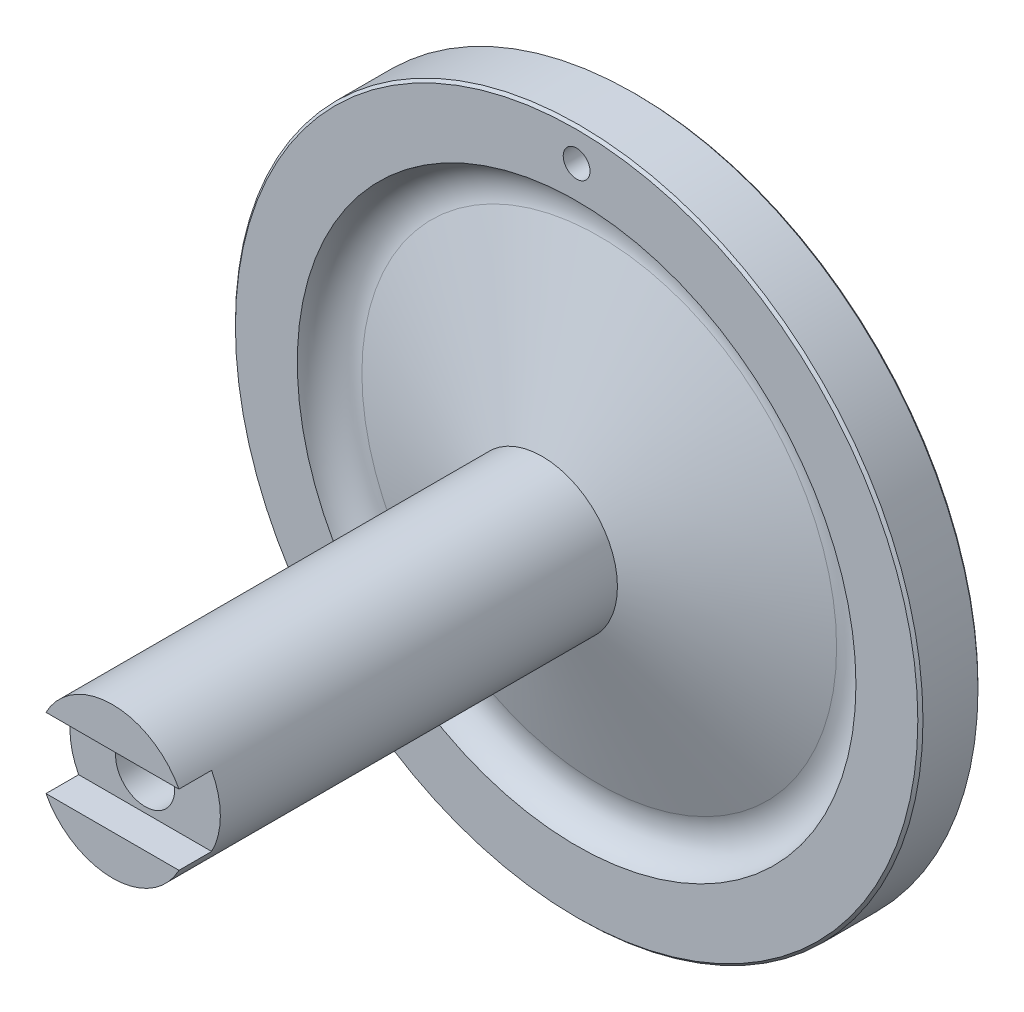
ISO-10303-21;
HEADER;
FILE_DESCRIPTION(('STEP AP214'),'2;1');
FILE_NAME('part.step','',(''),(''),'','','');
FILE_SCHEMA(('AUTOMOTIVE_DESIGN { 1 0 10303 214 1 1 1 1 }'));
ENDSEC;
DATA;
#1=APPLICATION_CONTEXT('core data for automotive mechanical design processes');
#2=APPLICATION_PROTOCOL_DEFINITION('international standard','automotive_design',2000,#1);
#3=PRODUCT_CONTEXT('',#1,'mechanical');
#4=PRODUCT('Part','Part','',(#3));
#5=PRODUCT_RELATED_PRODUCT_CATEGORY('part','',(#4));
#6=PRODUCT_DEFINITION_FORMATION('','',#4);
#7=PRODUCT_DEFINITION_CONTEXT('part definition',#1,'design');
#8=PRODUCT_DEFINITION('design','',#6,#7);
#9=PRODUCT_DEFINITION_SHAPE('','',#8);
#10=(LENGTH_UNIT() NAMED_UNIT(*) SI_UNIT(.MILLI.,.METRE.));
#11=(NAMED_UNIT(*) PLANE_ANGLE_UNIT() SI_UNIT($,.RADIAN.));
#12=(NAMED_UNIT(*) SI_UNIT($,.STERADIAN.) SOLID_ANGLE_UNIT());
#13=UNCERTAINTY_MEASURE_WITH_UNIT(LENGTH_MEASURE(1.E-05),#10,'distance_accuracy_value','');
#14=(GEOMETRIC_REPRESENTATION_CONTEXT(3) GLOBAL_UNCERTAINTY_ASSIGNED_CONTEXT((#13)) GLOBAL_UNIT_ASSIGNED_CONTEXT((#10,
#11,#12)) REPRESENTATION_CONTEXT('',''));
#15=CARTESIAN_POINT('',(0.,0.,0.));
#16=DIRECTION('',(0.,0.,1.));
#17=DIRECTION('',(1.,0.,0.));
#18=AXIS2_PLACEMENT_3D('',#15,#16,#17);
#19=CARTESIAN_POINT('',(0.,8.7376,0.));
#20=DIRECTION('',(0.,0.,-1.));
#21=DIRECTION('',(-1.,0.,0.));
#22=AXIS2_PLACEMENT_3D('',#19,#20,#21);
#23=PLANE('',#22);
#24=CARTESIAN_POINT('',(0.,0.,0.));
#25=DIRECTION('',(0.,0.,1.));
#26=DIRECTION('',(1.,0.,0.));
#27=AXIS2_PLACEMENT_3D('',#24,#25,#26);
#28=CIRCLE('',#27,22.225);
#29=CARTESIAN_POINT('',(19.6475854760833,10.3886,0.));
#30=VERTEX_POINT('',#29);
#31=CARTESIAN_POINT('',(-19.6475854760833,10.3886,0.));
#32=VERTEX_POINT('',#31);
#33=EDGE_CURVE('E146',#30,#32,#28,.T.);
#34=ORIENTED_EDGE('',*,*,#33,.T.);
#35=DIRECTION('',(1.,0.,0.));
#36=VECTOR('',#35,1.);
#37=CARTESIAN_POINT('',(-101.6,10.3886,0.));
#38=LINE('',#37,#36);
#39=EDGE_CURVE('E92',#32,#30,#38,.T.);
#40=ORIENTED_EDGE('',*,*,#39,.T.);
#41=EDGE_LOOP('',(#34,#40));
#42=FACE_BOUND('',#41,.T.);
#43=ADVANCED_FACE('F44',(#42),#23,.F.);
#44=CARTESIAN_POINT('',(0.,0.,0.));
#45=DIRECTION('',(0.,0.,1.));
#46=DIRECTION('',(1.,0.,0.));
#47=AXIS2_PLACEMENT_3D('',#44,#45,#46);
#48=CYLINDRICAL_SURFACE('',#47,22.225);
#49=ORIENTED_EDGE('',*,*,#33,.F.);
#50=DIRECTION('',(0.,0.,1.));
#51=VECTOR('',#50,1.);
#52=CARTESIAN_POINT('',(19.6475854760833,10.3886,0.));
#53=LINE('',#52,#51);
#54=CARTESIAN_POINT('',(19.6475854760833,10.3886,-9.652));
#55=VERTEX_POINT('',#54);
#56=EDGE_CURVE('E70',#30,#55,#53,.F.);
#57=ORIENTED_EDGE('',*,*,#56,.T.);
#58=CARTESIAN_POINT('',(0.,0.,-9.652));
#59=DIRECTION('',(0.,0.,-1.));
#60=DIRECTION('',(0.,1.,0.));
#61=AXIS2_PLACEMENT_3D('',#58,#59,#60);
#62=CIRCLE('',#61,22.225);
#63=CARTESIAN_POINT('',(19.6475854760833,-10.3886,-9.652));
#64=VERTEX_POINT('',#63);
#65=EDGE_CURVE('E104',#55,#64,#62,.T.);
#66=ORIENTED_EDGE('',*,*,#65,.T.);
#67=DIRECTION('',(0.,0.,1.));
#68=VECTOR('',#67,1.);
#69=CARTESIAN_POINT('',(19.6475854760833,-10.3886,0.));
#70=LINE('',#69,#68);
#71=CARTESIAN_POINT('',(19.6475854760833,-10.3886,0.));
#72=VERTEX_POINT('',#71);
#73=EDGE_CURVE('E118',#64,#72,#70,.T.);
#74=ORIENTED_EDGE('',*,*,#73,.T.);
#75=CARTESIAN_POINT('',(-19.6475854760833,-10.3886,0.));
#76=VERTEX_POINT('',#75);
#77=EDGE_CURVE('E145',#76,#72,#28,.T.);
#78=ORIENTED_EDGE('',*,*,#77,.F.);
#79=DIRECTION('',(0.,0.,1.));
#80=VECTOR('',#79,1.);
#81=CARTESIAN_POINT('',(-19.6475854760833,-10.3886,0.));
#82=LINE('',#81,#80);
#83=CARTESIAN_POINT('',(-19.6475854760833,-10.3886,-9.652));
#84=VERTEX_POINT('',#83);
#85=EDGE_CURVE('E62',#76,#84,#82,.F.);
#86=ORIENTED_EDGE('',*,*,#85,.T.);
#87=CARTESIAN_POINT('',(-19.6475854760833,10.3886,-9.652));
#88=VERTEX_POINT('',#87);
#89=EDGE_CURVE('E102',#84,#88,#62,.T.);
#90=ORIENTED_EDGE('',*,*,#89,.T.);
#91=DIRECTION('',(0.,0.,1.));
#92=VECTOR('',#91,1.);
#93=CARTESIAN_POINT('',(-19.6475854760833,10.3886,0.));
#94=LINE('',#93,#92);
#95=EDGE_CURVE('E88',#88,#32,#94,.T.);
#96=ORIENTED_EDGE('',*,*,#95,.T.);
#97=EDGE_LOOP('',(#49,#57,#66,#74,#78,#86,#90,#96));
#98=FACE_BOUND('',#97,.T.);
#99=CARTESIAN_POINT('',(0.,0.,-127.));
#100=DIRECTION('',(0.,0.,1.));
#101=DIRECTION('',(1.,0.,0.));
#102=AXIS2_PLACEMENT_3D('',#99,#100,#101);
#103=CIRCLE('',#102,22.225);
#104=CARTESIAN_POINT('',(-22.225,0.,-127.));
#105=VERTEX_POINT('',#104);
#106=EDGE_CURVE('E97',#105,#105,#103,.T.);
#107=ORIENTED_EDGE('',*,*,#106,.T.);
#108=EDGE_LOOP('',(#107));
#109=FACE_BOUND('',#108,.T.);
#110=ADVANCED_FACE('F107',(#98,#109),#48,.T.);
#111=ORIENTED_EDGE('',*,*,#77,.T.);
#112=DIRECTION('',(1.,0.,0.));
#113=VECTOR('',#112,1.);
#114=CARTESIAN_POINT('',(-101.6,-10.3886,0.));
#115=LINE('',#114,#113);
#116=EDGE_CURVE('E115',#76,#72,#115,.T.);
#117=ORIENTED_EDGE('',*,*,#116,.F.);
#118=EDGE_LOOP('',(#111,#117));
#119=FACE_BOUND('',#118,.T.);
#120=ADVANCED_FACE('F197',(#119),#23,.F.);
#121=CARTESIAN_POINT('',(0.,0.,0.));
#122=DIRECTION('',(0.,0.,1.));
#123=DIRECTION('',(1.,0.,0.));
#124=AXIS2_PLACEMENT_3D('',#121,#122,#123);
#125=CYLINDRICAL_SURFACE('',#124,8.7376);
#126=CARTESIAN_POINT('',(0.,0.,-9.652));
#127=DIRECTION('',(0.,0.,-1.));
#128=DIRECTION('',(0.,1.,0.));
#129=AXIS2_PLACEMENT_3D('',#126,#127,#128);
#130=CIRCLE('',#129,8.7376);
#131=CARTESIAN_POINT('',(0.,8.7376,-9.652));
#132=VERTEX_POINT('',#131);
#133=EDGE_CURVE('E110',#132,#132,#130,.F.);
#134=ORIENTED_EDGE('',*,*,#133,.T.);
#135=EDGE_LOOP('',(#134));
#136=FACE_BOUND('',#135,.T.);
#137=CARTESIAN_POINT('',(0.,0.,-147.0152));
#138=DIRECTION('',(0.,0.,1.));
#139=DIRECTION('',(1.,0.,0.));
#140=AXIS2_PLACEMENT_3D('',#137,#138,#139);
#141=CIRCLE('',#140,8.7376);
#142=CARTESIAN_POINT('',(8.7376,0.,-147.0152));
#143=VERTEX_POINT('',#142);
#144=EDGE_CURVE('E142',#143,#143,#141,.T.);
#145=ORIENTED_EDGE('',*,*,#144,.F.);
#146=EDGE_LOOP('',(#145));
#147=FACE_BOUND('',#146,.T.);
#148=ADVANCED_FACE('F205',(#136,#147),#125,.F.);
#149=CARTESIAN_POINT('',(0.,15.875,-147.0152));
#150=DIRECTION('',(0.,0.,1.));
#151=DIRECTION('',(1.,0.,0.));
#152=AXIS2_PLACEMENT_3D('',#149,#150,#151);
#153=PLANE('',#152);
#154=CARTESIAN_POINT('',(0.,0.,-147.0152));
#155=DIRECTION('',(0.,0.,1.));
#156=DIRECTION('',(1.,0.,0.));
#157=AXIS2_PLACEMENT_3D('',#154,#155,#156);
#158=CIRCLE('',#157,15.875);
#159=CARTESIAN_POINT('',(15.875,0.,-147.0152));
#160=VERTEX_POINT('',#159);
#161=EDGE_CURVE('E139',#160,#160,#158,.T.);
#162=ORIENTED_EDGE('',*,*,#161,.F.);
#163=EDGE_LOOP('',(#162));
#164=FACE_BOUND('',#163,.T.);
#165=ORIENTED_EDGE('',*,*,#144,.T.);
#166=EDGE_LOOP('',(#165));
#167=FACE_BOUND('',#166,.T.);
#168=ADVANCED_FACE('F210',(#164,#167),#153,.F.);
#169=CARTESIAN_POINT('',(0.,0.,-147.0152));
#170=DIRECTION('',(0.,0.,1.));
#171=DIRECTION('',(1.,0.,0.));
#172=AXIS2_PLACEMENT_3D('',#169,#170,#171);
#173=CONICAL_SURFACE('',#172,15.875,0.855211333477219);
#174=CARTESIAN_POINT('',(0.,0.,-139.601754698429));
#175=DIRECTION('',(0.,0.,1.));
#176=DIRECTION('',(1.,0.,0.));
#177=AXIS2_PLACEMENT_3D('',#174,#175,#176);
#178=CIRCLE('',#177,24.4031932635884);
#179=CARTESIAN_POINT('',(24.4031932635884,0.,-139.601754698429));
#180=VERTEX_POINT('',#179);
#181=EDGE_CURVE('E136',#180,#180,#178,.T.);
#182=ORIENTED_EDGE('',*,*,#181,.F.);
#183=EDGE_LOOP('',(#182));
#184=FACE_BOUND('',#183,.T.);
#185=ORIENTED_EDGE('',*,*,#161,.T.);
#186=EDGE_LOOP('',(#185));
#187=FACE_BOUND('',#186,.T.);
#188=ADVANCED_FACE('F249',(#184,#187),#173,.T.);
#189=CARTESIAN_POINT('',(0.,0.,-146.790363450051));
#190=DIRECTION('',(0.,0.,1.));
#191=DIRECTION('',(1.,0.,0.));
#192=AXIS2_PLACEMENT_3D('',#189,#190,#191);
#193=TOROIDAL_SURFACE('',#192,30.652155514723,9.52500000000004);
#194=CARTESIAN_POINT('',(0.,0.,-137.804544361742));
#195=DIRECTION('',(0.,0.,1.));
#196=DIRECTION('',(1.,0.,0.));
#197=AXIS2_PLACEMENT_3D('',#194,#195,#196);
#198=CIRCLE('',#197,33.8113769872031);
#199=CARTESIAN_POINT('',(33.8113769872031,0.,-137.804544361742));
#200=VERTEX_POINT('',#199);
#201=EDGE_CURVE('E133',#200,#200,#198,.T.);
#202=ORIENTED_EDGE('',*,*,#201,.F.);
#203=EDGE_LOOP('',(#202));
#204=FACE_BOUND('',#203,.T.);
#205=ORIENTED_EDGE('',*,*,#181,.T.);
#206=EDGE_LOOP('',(#205));
#207=FACE_BOUND('',#206,.T.);
#208=ADVANCED_FACE('F252',(#204,#207),#193,.F.);
#209=CARTESIAN_POINT('',(0.,0.,-137.804544361742));
#210=DIRECTION('',(0.,0.,-1.));
#211=DIRECTION('',(-1.,0.,0.));
#212=AXIS2_PLACEMENT_3D('',#209,#210,#211);
#213=CONICAL_SURFACE('',#212,33.8113769872031,1.23271589707042);
#214=CARTESIAN_POINT('',(0.,0.,-154.94));
#215=DIRECTION('',(0.,0.,1.));
#216=DIRECTION('',(1.,0.,0.));
#217=AXIS2_PLACEMENT_3D('',#214,#215,#216);
#218=CIRCLE('',#217,82.55);
#219=CARTESIAN_POINT('',(82.55,0.,-154.94));
#220=VERTEX_POINT('',#219);
#221=EDGE_CURVE('E130',#220,#220,#218,.T.);
#222=ORIENTED_EDGE('',*,*,#221,.F.);
#223=EDGE_LOOP('',(#222));
#224=FACE_BOUND('',#223,.T.);
#225=ORIENTED_EDGE('',*,*,#201,.T.);
#226=EDGE_LOOP('',(#225));
#227=FACE_BOUND('',#226,.T.);
#228=ADVANCED_FACE('F255',(#224,#227),#213,.F.);
#229=CARTESIAN_POINT('',(0.,101.6,-154.94));
#230=DIRECTION('',(0.,0.,1.));
#231=DIRECTION('',(1.,0.,0.));
#232=AXIS2_PLACEMENT_3D('',#229,#230,#231);
#233=PLANE('',#232);
#234=CARTESIAN_POINT('',(0.,92.075,-154.94));
#235=DIRECTION('',(0.,0.,-1.));
#236=DIRECTION('',(-1.,0.,0.));
#237=AXIS2_PLACEMENT_3D('',#234,#235,#236);
#238=CIRCLE('',#237,3.9624);
#239=CARTESIAN_POINT('',(-3.9624,92.075,-154.94));
#240=VERTEX_POINT('',#239);
#241=EDGE_CURVE('E216',#240,#240,#238,.T.);
#242=ORIENTED_EDGE('',*,*,#241,.F.);
#243=EDGE_LOOP('',(#242));
#244=FACE_BOUND('',#243,.T.);
#245=CARTESIAN_POINT('',(0.,0.,-154.94));
#246=DIRECTION('',(0.,0.,1.));
#247=DIRECTION('',(1.,0.,0.));
#248=AXIS2_PLACEMENT_3D('',#245,#246,#247);
#249=CIRCLE('',#248,100.838);
#250=CARTESIAN_POINT('',(100.838,0.,-154.94));
#251=VERTEX_POINT('',#250);
#252=EDGE_CURVE('E54',#251,#251,#249,.F.);
#253=ORIENTED_EDGE('',*,*,#252,.T.);
#254=EDGE_LOOP('',(#253));
#255=FACE_BOUND('',#254,.T.);
#256=ORIENTED_EDGE('',*,*,#221,.T.);
#257=EDGE_LOOP('',(#256));
#258=FACE_BOUND('',#257,.T.);
#259=ADVANCED_FACE('F157',(#244,#255,#258),#233,.F.);
#260=CARTESIAN_POINT('',(0.,0.,0.));
#261=DIRECTION('',(0.,0.,1.));
#262=DIRECTION('',(1.,0.,0.));
#263=AXIS2_PLACEMENT_3D('',#260,#261,#262);
#264=CYLINDRICAL_SURFACE('',#263,101.6);
#265=CARTESIAN_POINT('',(0.,0.,-154.178));
#266=DIRECTION('',(0.,0.,1.));
#267=DIRECTION('',(1.,0.,0.));
#268=AXIS2_PLACEMENT_3D('',#265,#266,#267);
#269=CIRCLE('',#268,101.6);
#270=CARTESIAN_POINT('',(101.6,0.,-154.178));
#271=VERTEX_POINT('',#270);
#272=EDGE_CURVE('E151',#271,#271,#269,.T.);
#273=ORIENTED_EDGE('',*,*,#272,.T.);
#274=EDGE_LOOP('',(#273));
#275=FACE_BOUND('',#274,.T.);
#276=CARTESIAN_POINT('',(0.,0.,-137.922));
#277=DIRECTION('',(0.,0.,-1.));
#278=DIRECTION('',(-1.,0.,0.));
#279=AXIS2_PLACEMENT_3D('',#276,#277,#278);
#280=CIRCLE('',#279,101.6);
#281=CARTESIAN_POINT('',(-101.6,0.,-137.922));
#282=VERTEX_POINT('',#281);
#283=EDGE_CURVE('E148',#282,#282,#280,.T.);
#284=ORIENTED_EDGE('',*,*,#283,.T.);
#285=EDGE_LOOP('',(#284));
#286=FACE_BOUND('',#285,.T.);
#287=ADVANCED_FACE('F166',(#275,#286),#264,.T.);
#288=CARTESIAN_POINT('',(0.,82.55,-137.16));
#289=DIRECTION('',(0.,0.,-1.));
#290=DIRECTION('',(-1.,0.,0.));
#291=AXIS2_PLACEMENT_3D('',#288,#289,#290);
#292=PLANE('',#291);
#293=CARTESIAN_POINT('',(0.,92.075,-137.16));
#294=DIRECTION('',(0.,0.,-1.));
#295=DIRECTION('',(-1.,0.,0.));
#296=AXIS2_PLACEMENT_3D('',#293,#294,#295);
#297=CIRCLE('',#296,3.9624);
#298=CARTESIAN_POINT('',(-3.9624,92.075,-137.16));
#299=VERTEX_POINT('',#298);
#300=EDGE_CURVE('E49',#299,#299,#297,.T.);
#301=ORIENTED_EDGE('',*,*,#300,.T.);
#302=EDGE_LOOP('',(#301));
#303=FACE_BOUND('',#302,.T.);
#304=CARTESIAN_POINT('',(0.,0.,-137.16));
#305=DIRECTION('',(0.,0.,-1.));
#306=DIRECTION('',(-1.,0.,0.));
#307=AXIS2_PLACEMENT_3D('',#304,#305,#306);
#308=CIRCLE('',#307,100.838);
#309=CARTESIAN_POINT('',(-100.838,0.,-137.16));
#310=VERTEX_POINT('',#309);
#311=EDGE_CURVE('E11',#310,#310,#308,.F.);
#312=ORIENTED_EDGE('',*,*,#311,.T.);
#313=EDGE_LOOP('',(#312));
#314=FACE_BOUND('',#313,.T.);
#315=CARTESIAN_POINT('',(0.,0.,-137.16));
#316=DIRECTION('',(0.,0.,1.));
#317=DIRECTION('',(1.,0.,0.));
#318=AXIS2_PLACEMENT_3D('',#315,#316,#317);
#319=CIRCLE('',#318,82.55);
#320=CARTESIAN_POINT('',(82.55,0.,-137.16));
#321=VERTEX_POINT('',#320);
#322=EDGE_CURVE('E127',#321,#321,#319,.T.);
#323=ORIENTED_EDGE('',*,*,#322,.F.);
#324=EDGE_LOOP('',(#323));
#325=FACE_BOUND('',#324,.T.);
#326=ADVANCED_FACE('F169',(#303,#314,#325),#292,.F.);
#327=CARTESIAN_POINT('',(0.,0.,-134.862532676352));
#328=DIRECTION('',(0.,0.,1.));
#329=DIRECTION('',(1.,0.,0.));
#330=AXIS2_PLACEMENT_3D('',#327,#328,#329);
#331=TOROIDAL_SURFACE('',#330,73.3062308068208,9.52499999999998);
#332=CARTESIAN_POINT('',(0.,0.,-143.848351764661));
#333=DIRECTION('',(0.,0.,1.));
#334=DIRECTION('',(1.,0.,0.));
#335=AXIS2_PLACEMENT_3D('',#332,#333,#334);
#336=CIRCLE('',#335,70.1470093343408);
#337=CARTESIAN_POINT('',(-70.1470093343408,0.,-143.848351764661));
#338=VERTEX_POINT('',#337);
#339=EDGE_CURVE('E124',#338,#338,#336,.T.);
#340=ORIENTED_EDGE('',*,*,#339,.F.);
#341=EDGE_LOOP('',(#340));
#342=FACE_BOUND('',#341,.T.);
#343=ORIENTED_EDGE('',*,*,#322,.T.);
#344=EDGE_LOOP('',(#343));
#345=FACE_BOUND('',#344,.T.);
#346=ADVANCED_FACE('F179',(#342,#345),#331,.F.);
#347=CARTESIAN_POINT('',(0.,0.,-143.848351764661));
#348=DIRECTION('',(0.,0.,-1.));
#349=DIRECTION('',(-1.,0.,0.));
#350=AXIS2_PLACEMENT_3D('',#347,#348,#349);
#351=CONICAL_SURFACE('',#350,70.1470093343408,1.23271589707042);
#352=CARTESIAN_POINT('',(-22.225,0.,-127.));
#353=CARTESIAN_POINT('',(-22.7241875972328,0.,-127.175503664215));
#354=CARTESIAN_POINT('',(-23.2233751944655,0.,-127.35100732843));
#355=CARTESIAN_POINT('',(-24.2217503889309,0.,-127.702014656861));
#356=CARTESIAN_POINT('',(-24.7209379861636,0.,-127.877518321076));
#357=CARTESIAN_POINT('',(-25.7193131806291,0.,-128.228525649507));
#358=CARTESIAN_POINT('',(-26.2185007778618,0.,-128.404029313722));
#359=CARTESIAN_POINT('',(-27.2168759723272,0.,-128.755036642152));
#360=CARTESIAN_POINT('',(-27.7160635695599,0.,-128.930540306367));
#361=CARTESIAN_POINT('',(-28.7144387640254,0.,-129.281547634798));
#362=CARTESIAN_POINT('',(-29.2136263612581,0.,-129.457051299013));
#363=CARTESIAN_POINT('',(-30.2120015557235,0.,-129.808058627444));
#364=CARTESIAN_POINT('',(-30.7111891529562,0.,-129.983562291659));
#365=CARTESIAN_POINT('',(-31.7095643474217,0.,-130.334569620089));
#366=CARTESIAN_POINT('',(-32.2087519446544,0.,-130.510073284304));
#367=CARTESIAN_POINT('',(-33.2071271391198,0.,-130.861080612735));
#368=CARTESIAN_POINT('',(-33.7063147363525,0.,-131.03658427695));
#369=CARTESIAN_POINT('',(-34.704689930818,0.,-131.38759160538));
#370=CARTESIAN_POINT('',(-35.2038775280507,0.,-131.563095269596));
#371=CARTESIAN_POINT('',(-36.2022527225161,0.,-131.914102598026));
#372=CARTESIAN_POINT('',(-36.7014403197488,0.,-132.089606262241));
#373=CARTESIAN_POINT('',(-37.6998155142143,0.,-132.440613590672));
#374=CARTESIAN_POINT('',(-38.199003111447,0.,-132.616117254887));
#375=CARTESIAN_POINT('',(-39.1973783059124,0.,-132.967124583317));
#376=CARTESIAN_POINT('',(-39.6965659031451,0.,-133.142628247533));
#377=CARTESIAN_POINT('',(-40.6949410976106,0.,-133.493635575963));
#378=CARTESIAN_POINT('',(-41.1941286948433,0.,-133.669139240178));
#379=CARTESIAN_POINT('',(-42.1925038893087,0.,-134.020146568609));
#380=CARTESIAN_POINT('',(-42.6916914865414,0.,-134.195650232824));
#381=CARTESIAN_POINT('',(-43.6900666810069,0.,-134.546657561254));
#382=CARTESIAN_POINT('',(-44.1892542782396,0.,-134.72216122547));
#383=CARTESIAN_POINT('',(-45.187629472705,0.,-135.0731685539));
#384=CARTESIAN_POINT('',(-45.6868170699377,0.,-135.248672218115));
#385=CARTESIAN_POINT('',(-46.6851922644032,0.,-135.599679546546));
#386=CARTESIAN_POINT('',(-47.1843798616359,0.,-135.775183210761));
#387=CARTESIAN_POINT('',(-48.1827550561013,0.,-136.126190539191));
#388=CARTESIAN_POINT('',(-48.681942653334,0.,-136.301694203407));
#389=CARTESIAN_POINT('',(-49.6803178477995,0.,-136.652701531837));
#390=CARTESIAN_POINT('',(-50.1795054450322,0.,-136.828205196052));
#391=CARTESIAN_POINT('',(-51.1778806394976,0.,-137.179212524483));
#392=CARTESIAN_POINT('',(-51.6770682367303,0.,-137.354716188698));
#393=CARTESIAN_POINT('',(-52.6754434311958,0.,-137.705723517128));
#394=CARTESIAN_POINT('',(-53.1746310284285,0.,-137.881227181344));
#395=CARTESIAN_POINT('',(-54.1730062228939,0.,-138.232234509774));
#396=CARTESIAN_POINT('',(-54.6721938201266,0.,-138.407738173989));
#397=CARTESIAN_POINT('',(-55.6705690145921,0.,-138.75874550242));
#398=CARTESIAN_POINT('',(-56.1697566118248,0.,-138.934249166635));
#399=CARTESIAN_POINT('',(-57.1681318062902,0.,-139.285256495065));
#400=CARTESIAN_POINT('',(-57.6673194035229,0.,-139.460760159281));
#401=CARTESIAN_POINT('',(-58.6656945979884,0.,-139.811767487711));
#402=CARTESIAN_POINT('',(-59.1648821952211,0.,-139.987271151926));
#403=CARTESIAN_POINT('',(-60.1632573896865,0.,-140.338278480357));
#404=CARTESIAN_POINT('',(-60.6624449869192,0.,-140.513782144572));
#405=CARTESIAN_POINT('',(-61.6608201813847,0.,-140.864789473002));
#406=CARTESIAN_POINT('',(-62.1600077786174,0.,-141.040293137218));
#407=CARTESIAN_POINT('',(-63.1583829730828,0.,-141.391300465648));
#408=CARTESIAN_POINT('',(-63.6575705703155,0.,-141.566804129863));
#409=CARTESIAN_POINT('',(-64.655945764781,0.,-141.917811458294));
#410=CARTESIAN_POINT('',(-65.1551333620137,0.,-142.093315122509));
#411=CARTESIAN_POINT('',(-66.1535085564791,0.,-142.444322450939));
#412=CARTESIAN_POINT('',(-66.6526961537118,0.,-142.619826115154));
#413=CARTESIAN_POINT('',(-67.6510713481773,0.,-142.970833443585));
#414=CARTESIAN_POINT('',(-68.15025894541,0.,-143.1463371078));
#415=CARTESIAN_POINT('',(-69.1486341398754,0.,-143.497344436231));
#416=CARTESIAN_POINT('',(-69.6478217371081,0.,-143.672848100446));
#417=CARTESIAN_POINT('',(-70.1470093343408,0.,-143.848351764661));
#418=B_SPLINE_CURVE_WITH_KNOTS('',3,(#352,#353,#354,#355,#356,#357,#358,#359,#360,#361,#362,
#363,#364,#365,#366,#367,#368,#369,#370,#371,#372,#373,#374,#375,#376,#377,#378,#379,#380,#381,
#382,#383,#384,#385,#386,#387,#388,#389,#390,#391,#392,#393,#394,#395,#396,#397,#398,#399,#400,
#401,#402,#403,#404,#405,#406,#407,#408,#409,#410,#411,#412,#413,#414,#415,#416,#417),
.UNSPECIFIED.,.F.,.F.,(4,2,2,2,2,2,2,2,2,2,2,2,2,2,2,2,2,2,2,2,2,2,2,2,2,2,2,2,2,2,2,2,4),(0.,
1.58742185333813,3.17484370667625,4.7622655600144,6.34968741335253,7.93710926669065,
9.52453112002879,11.1119529733669,12.6993748267051,14.2867966800432,15.8742185333813,
17.4616403867194,19.0490622400576,20.6364840933957,22.2239059467338,23.811327800072,
25.3987496534101,26.9861715067482,28.5735933600864,30.1610152134245,31.7484370667626,
33.3358589201008,34.9232807734389,36.510702626777,38.0981244801152,39.6855463334533,
41.2729681867914,42.8603900401296,44.4478118934677,46.0352337468058,47.622655600144,
49.2100774534821,50.7974993068202),.UNSPECIFIED.);
#419=EDGE_CURVE('BSEAM163',#105,#338,#418,.T.);
#420=ORIENTED_EDGE('',*,*,#106,.F.);
#421=ORIENTED_EDGE('',*,*,#339,.T.);
#422=ORIENTED_EDGE('',*,*,#419,.T.);
#423=ORIENTED_EDGE('',*,*,#419,.F.);
#424=EDGE_LOOP('',(#420,#422,#421,#423));
#425=FACE_BOUND('',#424,.T.);
#426=ADVANCED_FACE('F163',(#425),#351,.T.);
#427=CARTESIAN_POINT('',(0.,0.,-154.178));
#428=DIRECTION('',(0.,0.,1.));
#429=DIRECTION('',(1.,0.,0.));
#430=AXIS2_PLACEMENT_3D('',#427,#428,#429);
#431=CONICAL_SURFACE('',#430,101.6,0.785398163397412);
#432=ORIENTED_EDGE('',*,*,#252,.F.);
#433=EDGE_LOOP('',(#432));
#434=FACE_BOUND('',#433,.T.);
#435=ORIENTED_EDGE('',*,*,#272,.F.);
#436=EDGE_LOOP('',(#435));
#437=FACE_BOUND('',#436,.T.);
#438=ADVANCED_FACE('F160',(#434,#437),#431,.T.);
#439=CARTESIAN_POINT('',(0.,0.,-137.16));
#440=DIRECTION('',(0.,0.,-1.));
#441=DIRECTION('',(-1.,0.,0.));
#442=AXIS2_PLACEMENT_3D('',#439,#440,#441);
#443=CONICAL_SURFACE('',#442,100.838,0.78539816339743);
#444=ORIENTED_EDGE('',*,*,#283,.F.);
#445=EDGE_LOOP('',(#444));
#446=FACE_BOUND('',#445,.T.);
#447=ORIENTED_EDGE('',*,*,#311,.F.);
#448=EDGE_LOOP('',(#447));
#449=FACE_BOUND('',#448,.T.);
#450=ADVANCED_FACE('F47',(#446,#449),#443,.T.);
#451=CARTESIAN_POINT('',(-101.6,10.3886,-9.652));
#452=DIRECTION('',(0.,1.,0.));
#453=DIRECTION('',(0.,0.,1.));
#454=AXIS2_PLACEMENT_3D('',#451,#452,#453);
#455=PLANE('',#454);
#456=DIRECTION('',(1.,0.,0.));
#457=VECTOR('',#456,1.);
#458=CARTESIAN_POINT('',(-101.6,10.3886,-9.652));
#459=LINE('',#458,#457);
#460=EDGE_CURVE('E91',#88,#55,#459,.T.);
#461=ORIENTED_EDGE('',*,*,#460,.T.);
#462=ORIENTED_EDGE('',*,*,#56,.F.);
#463=ORIENTED_EDGE('',*,*,#39,.F.);
#464=ORIENTED_EDGE('',*,*,#95,.F.);
#465=EDGE_LOOP('',(#461,#462,#463,#464));
#466=FACE_BOUND('',#465,.T.);
#467=ADVANCED_FACE('F90',(#466),#455,.F.);
#468=CARTESIAN_POINT('',(-101.6,-10.3886,-9.652));
#469=DIRECTION('',(0.,-1.,0.));
#470=DIRECTION('',(0.,0.,-1.));
#471=AXIS2_PLACEMENT_3D('',#468,#469,#470);
#472=PLANE('',#471);
#473=DIRECTION('',(1.,0.,0.));
#474=VECTOR('',#473,1.);
#475=CARTESIAN_POINT('',(-101.6,-10.3886,-9.652));
#476=LINE('',#475,#474);
#477=EDGE_CURVE('E105',#84,#64,#476,.T.);
#478=ORIENTED_EDGE('',*,*,#477,.F.);
#479=ORIENTED_EDGE('',*,*,#85,.F.);
#480=ORIENTED_EDGE('',*,*,#116,.T.);
#481=ORIENTED_EDGE('',*,*,#73,.F.);
#482=EDGE_LOOP('',(#478,#479,#480,#481));
#483=FACE_BOUND('',#482,.T.);
#484=ADVANCED_FACE('F213',(#483),#472,.F.);
#485=CARTESIAN_POINT('',(-101.6,-10.3886,-9.652));
#486=DIRECTION('',(0.,0.,-1.));
#487=DIRECTION('',(0.,1.,0.));
#488=AXIS2_PLACEMENT_3D('',#485,#486,#487);
#489=PLANE('',#488);
#490=ORIENTED_EDGE('',*,*,#133,.F.);
#491=EDGE_LOOP('',(#490));
#492=FACE_BOUND('',#491,.T.);
#493=ORIENTED_EDGE('',*,*,#460,.F.);
#494=ORIENTED_EDGE('',*,*,#89,.F.);
#495=ORIENTED_EDGE('',*,*,#477,.T.);
#496=ORIENTED_EDGE('',*,*,#65,.F.);
#497=EDGE_LOOP('',(#493,#494,#495,#496));
#498=FACE_BOUND('',#497,.T.);
#499=ADVANCED_FACE('F100',(#492,#498),#489,.F.);
#500=CARTESIAN_POINT('',(0.,92.075,0.));
#501=DIRECTION('',(0.,0.,-1.));
#502=DIRECTION('',(-1.,0.,0.));
#503=AXIS2_PLACEMENT_3D('',#500,#501,#502);
#504=CYLINDRICAL_SURFACE('',#503,3.9624);
#505=ORIENTED_EDGE('',*,*,#241,.T.);
#506=EDGE_LOOP('',(#505));
#507=FACE_BOUND('',#506,.T.);
#508=ORIENTED_EDGE('',*,*,#300,.F.);
#509=EDGE_LOOP('',(#508));
#510=FACE_BOUND('',#509,.T.);
#511=ADVANCED_FACE('F223',(#507,#510),#504,.F.);
#512=CLOSED_SHELL('',(#43,#110,#120,#148,#168,#188,#208,#228,#259,#287,#326,#346,#426,#438,#450,
#467,#484,#499,#511));
#513=MANIFOLD_SOLID_BREP('B2',#512);
#514=ADVANCED_BREP_SHAPE_REPRESENTATION('',(#18,#513),#14);
#515=SHAPE_DEFINITION_REPRESENTATION(#9,#514);
ENDSEC;
END-ISO-10303-21;
